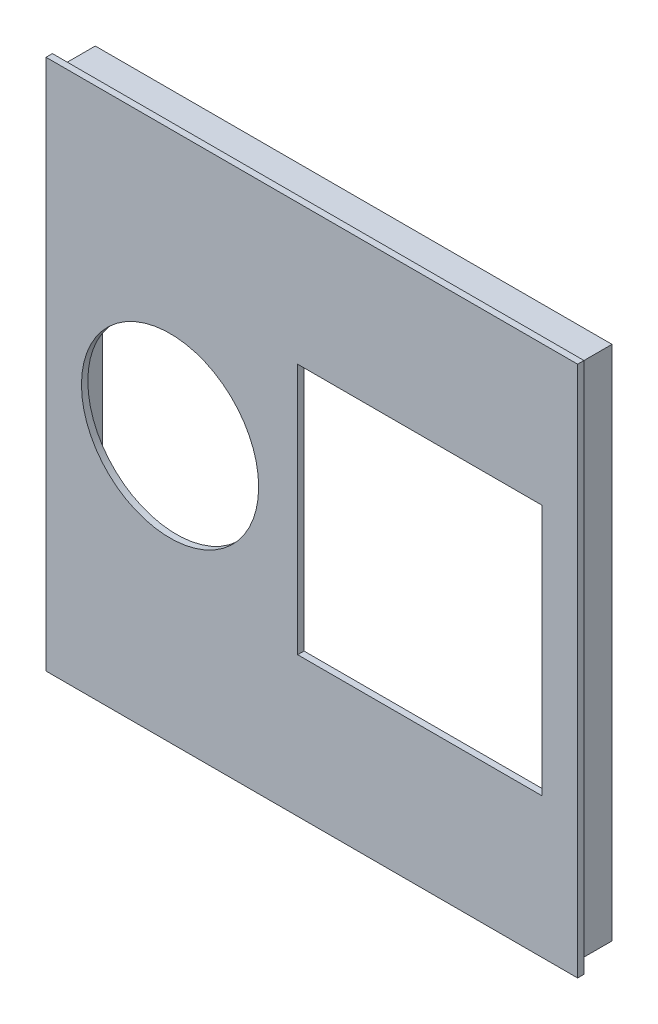
ISO-10303-21;
HEADER;
FILE_DESCRIPTION(('STEP AP214'),'2;1');
FILE_NAME('part.step','',(''),(''),'','','');
FILE_SCHEMA(('AUTOMOTIVE_DESIGN { 1 0 10303 214 1 1 1 1 }'));
ENDSEC;
DATA;
#1=APPLICATION_CONTEXT('core data for automotive mechanical design processes');
#2=APPLICATION_PROTOCOL_DEFINITION('international standard','automotive_design',2000,#1);
#3=PRODUCT_CONTEXT('',#1,'mechanical');
#4=PRODUCT('Part','Part','',(#3));
#5=PRODUCT_RELATED_PRODUCT_CATEGORY('part','',(#4));
#6=PRODUCT_DEFINITION_FORMATION('','',#4);
#7=PRODUCT_DEFINITION_CONTEXT('part definition',#1,'design');
#8=PRODUCT_DEFINITION('design','',#6,#7);
#9=PRODUCT_DEFINITION_SHAPE('','',#8);
#10=(LENGTH_UNIT() NAMED_UNIT(*) SI_UNIT(.MILLI.,.METRE.));
#11=(NAMED_UNIT(*) PLANE_ANGLE_UNIT() SI_UNIT($,.RADIAN.));
#12=(NAMED_UNIT(*) SI_UNIT($,.STERADIAN.) SOLID_ANGLE_UNIT());
#13=UNCERTAINTY_MEASURE_WITH_UNIT(LENGTH_MEASURE(1.E-05),#10,'distance_accuracy_value','');
#14=(GEOMETRIC_REPRESENTATION_CONTEXT(3) GLOBAL_UNCERTAINTY_ASSIGNED_CONTEXT((#13)) GLOBAL_UNIT_ASSIGNED_CONTEXT((#10,
#11,#12)) REPRESENTATION_CONTEXT('',''));
#15=CARTESIAN_POINT('',(0.,0.,0.));
#16=DIRECTION('',(0.,0.,1.));
#17=DIRECTION('',(1.,0.,0.));
#18=AXIS2_PLACEMENT_3D('',#15,#16,#17);
#19=CARTESIAN_POINT('',(0.,0.,0.));
#20=DIRECTION('',(0.,0.,1.));
#21=DIRECTION('',(1.,0.,0.));
#22=AXIS2_PLACEMENT_3D('',#19,#20,#21);
#23=PLANE('',#22);
#24=DIRECTION('',(0.,-1.,0.));
#25=VECTOR('',#24,1.);
#26=CARTESIAN_POINT('',(-17.4246522904172,7.44705882352941,0.));
#27=LINE('',#26,#25);
#28=CARTESIAN_POINT('',(-17.4246522904172,7.44705882352941,0.));
#29=VERTEX_POINT('',#28);
#30=CARTESIAN_POINT('',(-17.4246522904172,-142.552941176471,0.));
#31=VERTEX_POINT('',#30);
#32=EDGE_CURVE('E251',#29,#31,#27,.T.);
#33=ORIENTED_EDGE('',*,*,#32,.F.);
#34=DIRECTION('',(-1.,0.,0.));
#35=VECTOR('',#34,1.);
#36=CARTESIAN_POINT('',(-17.4246522904172,7.44705882352941,0.));
#37=LINE('',#36,#35);
#38=CARTESIAN_POINT('',(132.575347709583,7.44705882352941,0.));
#39=VERTEX_POINT('',#38);
#40=EDGE_CURVE('E256',#39,#29,#37,.T.);
#41=ORIENTED_EDGE('',*,*,#40,.F.);
#42=DIRECTION('',(0.,1.,0.));
#43=VECTOR('',#42,1.);
#44=CARTESIAN_POINT('',(132.575347709583,7.44705882352941,0.));
#45=LINE('',#44,#43);
#46=CARTESIAN_POINT('',(132.575347709583,-142.552941176471,0.));
#47=VERTEX_POINT('',#46);
#48=EDGE_CURVE('E267',#47,#39,#45,.T.);
#49=ORIENTED_EDGE('',*,*,#48,.F.);
#50=DIRECTION('',(1.,0.,0.));
#51=VECTOR('',#50,1.);
#52=CARTESIAN_POINT('',(-17.4246522904172,-142.552941176471,0.));
#53=LINE('',#52,#51);
#54=EDGE_CURVE('E265',#31,#47,#53,.T.);
#55=ORIENTED_EDGE('',*,*,#54,.F.);
#56=EDGE_LOOP('',(#33,#41,#49,#55));
#57=FACE_BOUND('',#56,.T.);
#58=DIRECTION('',(0.,1.,0.));
#59=VECTOR('',#58,1.);
#60=CARTESIAN_POINT('',(-15.3246522904172,-140.452941176471,0.));
#61=LINE('',#60,#59);
#62=CARTESIAN_POINT('',(-15.3246522904172,-140.452941176471,0.));
#63=VERTEX_POINT('',#62);
#64=CARTESIAN_POINT('',(-15.3246522904172,5.34705882352941,0.));
#65=VERTEX_POINT('',#64);
#66=EDGE_CURVE('E163',#63,#65,#61,.T.);
#67=ORIENTED_EDGE('',*,*,#66,.F.);
#68=DIRECTION('',(-1.,0.,0.));
#69=VECTOR('',#68,1.);
#70=CARTESIAN_POINT('',(-15.3246522904172,-140.452941176471,0.));
#71=LINE('',#70,#69);
#72=CARTESIAN_POINT('',(130.475347709583,-140.452941176471,0.));
#73=VERTEX_POINT('',#72);
#74=EDGE_CURVE('E191',#73,#63,#71,.T.);
#75=ORIENTED_EDGE('',*,*,#74,.F.);
#76=DIRECTION('',(0.,-1.,0.));
#77=VECTOR('',#76,1.);
#78=CARTESIAN_POINT('',(130.475347709583,-140.452941176471,0.));
#79=LINE('',#78,#77);
#80=CARTESIAN_POINT('',(130.475347709583,5.34705882352939,0.));
#81=VERTEX_POINT('',#80);
#82=EDGE_CURVE('E53',#81,#73,#79,.T.);
#83=ORIENTED_EDGE('',*,*,#82,.F.);
#84=DIRECTION('',(1.,0.,0.));
#85=VECTOR('',#84,1.);
#86=CARTESIAN_POINT('',(-15.3246522904172,5.34705882352941,0.));
#87=LINE('',#86,#85);
#88=EDGE_CURVE('E48',#65,#81,#87,.T.);
#89=ORIENTED_EDGE('',*,*,#88,.F.);
#90=EDGE_LOOP('',(#67,#75,#83,#89));
#91=FACE_BOUND('',#90,.T.);
#92=ADVANCED_FACE('F33',(#57,#91),#23,.F.);
#93=CARTESIAN_POINT('',(0.,0.,1.8));
#94=DIRECTION('',(0.,0.,1.));
#95=DIRECTION('',(1.,0.,0.));
#96=AXIS2_PLACEMENT_3D('',#93,#94,#95);
#97=PLANE('',#96);
#98=DIRECTION('',(1.,0.,0.));
#99=VECTOR('',#98,1.);
#100=CARTESIAN_POINT('',(53.5753477095828,-103.052941176471,1.8));
#101=LINE('',#100,#99);
#102=CARTESIAN_POINT('',(53.5753477095828,-103.052941176471,1.8));
#103=VERTEX_POINT('',#102);
#104=CARTESIAN_POINT('',(122.575347709583,-103.052941176471,1.8));
#105=VERTEX_POINT('',#104);
#106=EDGE_CURVE('E223',#103,#105,#101,.T.);
#107=ORIENTED_EDGE('',*,*,#106,.F.);
#108=DIRECTION('',(0.,-1.,0.));
#109=VECTOR('',#108,1.);
#110=CARTESIAN_POINT('',(53.5753477095828,-32.0529411764706,1.8));
#111=LINE('',#110,#109);
#112=CARTESIAN_POINT('',(53.5753477095828,-32.0529411764706,1.8));
#113=VERTEX_POINT('',#112);
#114=EDGE_CURVE('E221',#113,#103,#111,.T.);
#115=ORIENTED_EDGE('',*,*,#114,.F.);
#116=DIRECTION('',(-1.,0.,0.));
#117=VECTOR('',#116,1.);
#118=CARTESIAN_POINT('',(53.5753477095828,-32.0529411764706,1.8));
#119=LINE('',#118,#117);
#120=CARTESIAN_POINT('',(122.575347709583,-32.0529411764706,1.8));
#121=VERTEX_POINT('',#120);
#122=EDGE_CURVE('E229',#121,#113,#119,.T.);
#123=ORIENTED_EDGE('',*,*,#122,.F.);
#124=DIRECTION('',(0.,1.,0.));
#125=VECTOR('',#124,1.);
#126=CARTESIAN_POINT('',(122.575347709583,-32.0529411764706,1.8));
#127=LINE('',#126,#125);
#128=EDGE_CURVE('E226',#105,#121,#127,.T.);
#129=ORIENTED_EDGE('',*,*,#128,.F.);
#130=EDGE_LOOP('',(#107,#115,#123,#129));
#131=FACE_BOUND('',#130,.T.);
#132=DIRECTION('',(0.,-1.,0.));
#133=VECTOR('',#132,1.);
#134=CARTESIAN_POINT('',(-17.4246522904172,7.44705882352941,1.8));
#135=LINE('',#134,#133);
#136=CARTESIAN_POINT('',(-17.4246522904172,7.44705882352941,1.8));
#137=VERTEX_POINT('',#136);
#138=CARTESIAN_POINT('',(-17.4246522904172,-142.552941176471,1.8));
#139=VERTEX_POINT('',#138);
#140=EDGE_CURVE('E252',#137,#139,#135,.T.);
#141=ORIENTED_EDGE('',*,*,#140,.T.);
#142=DIRECTION('',(1.,0.,0.));
#143=VECTOR('',#142,1.);
#144=CARTESIAN_POINT('',(-17.4246522904172,-142.552941176471,1.8));
#145=LINE('',#144,#143);
#146=CARTESIAN_POINT('',(132.575347709583,-142.552941176471,1.8));
#147=VERTEX_POINT('',#146);
#148=EDGE_CURVE('E255',#139,#147,#145,.T.);
#149=ORIENTED_EDGE('',*,*,#148,.T.);
#150=DIRECTION('',(0.,1.,0.));
#151=VECTOR('',#150,1.);
#152=CARTESIAN_POINT('',(132.575347709583,7.44705882352941,1.8));
#153=LINE('',#152,#151);
#154=CARTESIAN_POINT('',(132.575347709583,7.44705882352941,1.8));
#155=VERTEX_POINT('',#154);
#156=EDGE_CURVE('E258',#147,#155,#153,.T.);
#157=ORIENTED_EDGE('',*,*,#156,.T.);
#158=DIRECTION('',(-1.,0.,0.));
#159=VECTOR('',#158,1.);
#160=CARTESIAN_POINT('',(-17.4246522904172,7.44705882352941,1.8));
#161=LINE('',#160,#159);
#162=EDGE_CURVE('E260',#155,#137,#161,.T.);
#163=ORIENTED_EDGE('',*,*,#162,.T.);
#164=EDGE_LOOP('',(#141,#149,#157,#163));
#165=FACE_BOUND('',#164,.T.);
#166=CARTESIAN_POINT('',(17.5753477095828,-67.5529411764706,1.8));
#167=DIRECTION('',(0.,0.,1.));
#168=DIRECTION('',(1.,0.,0.));
#169=AXIS2_PLACEMENT_3D('',#166,#167,#168);
#170=CIRCLE('',#169,25.);
#171=CARTESIAN_POINT('',(42.5753477095828,-67.5529411764706,1.8));
#172=VERTEX_POINT('',#171);
#173=EDGE_CURVE('E215',#172,#172,#170,.T.);
#174=ORIENTED_EDGE('',*,*,#173,.F.);
#175=EDGE_LOOP('',(#174));
#176=FACE_BOUND('',#175,.T.);
#177=ADVANCED_FACE('F293',(#131,#165,#176),#97,.T.);
#178=DIRECTION('',(-1.,0.,0.));
#179=VECTOR('',#178,1.);
#180=CARTESIAN_POINT('',(-13.2246522904172,-138.352941176471,0.));
#181=LINE('',#180,#179);
#182=CARTESIAN_POINT('',(128.375347709583,-138.352941176471,0.));
#183=VERTEX_POINT('',#182);
#184=CARTESIAN_POINT('',(-13.2246522904172,-138.352941176471,0.));
#185=VERTEX_POINT('',#184);
#186=EDGE_CURVE('E156',#183,#185,#181,.T.);
#187=ORIENTED_EDGE('',*,*,#186,.T.);
#188=DIRECTION('',(0.,1.,0.));
#189=VECTOR('',#188,1.);
#190=CARTESIAN_POINT('',(-13.2246522904172,-138.352941176471,0.));
#191=LINE('',#190,#189);
#192=CARTESIAN_POINT('',(-13.2246522904172,3.24705882352941,0.));
#193=VERTEX_POINT('',#192);
#194=EDGE_CURVE('E175',#185,#193,#191,.T.);
#195=ORIENTED_EDGE('',*,*,#194,.T.);
#196=DIRECTION('',(1.,0.,0.));
#197=VECTOR('',#196,1.);
#198=CARTESIAN_POINT('',(-13.2246522904172,3.24705882352941,0.));
#199=LINE('',#198,#197);
#200=CARTESIAN_POINT('',(128.375347709583,3.24705882352939,0.));
#201=VERTEX_POINT('',#200);
#202=EDGE_CURVE('E162',#193,#201,#199,.T.);
#203=ORIENTED_EDGE('',*,*,#202,.T.);
#204=DIRECTION('',(0.,-1.,0.));
#205=VECTOR('',#204,1.);
#206=CARTESIAN_POINT('',(128.375347709583,-138.352941176471,0.));
#207=LINE('',#206,#205);
#208=EDGE_CURVE('E178',#201,#183,#207,.T.);
#209=ORIENTED_EDGE('',*,*,#208,.T.);
#210=EDGE_LOOP('',(#187,#195,#203,#209));
#211=FACE_BOUND('',#210,.T.);
#212=DIRECTION('',(0.,-1.,0.));
#213=VECTOR('',#212,1.);
#214=CARTESIAN_POINT('',(53.5753477095828,-32.0529411764706,0.));
#215=LINE('',#214,#213);
#216=CARTESIAN_POINT('',(53.5753477095828,-32.0529411764706,0.));
#217=VERTEX_POINT('',#216);
#218=CARTESIAN_POINT('',(53.5753477095828,-103.052941176471,0.));
#219=VERTEX_POINT('',#218);
#220=EDGE_CURVE('E218',#217,#219,#215,.T.);
#221=ORIENTED_EDGE('',*,*,#220,.T.);
#222=DIRECTION('',(1.,0.,0.));
#223=VECTOR('',#222,1.);
#224=CARTESIAN_POINT('',(53.5753477095828,-103.052941176471,0.));
#225=LINE('',#224,#223);
#226=CARTESIAN_POINT('',(122.575347709583,-103.052941176471,0.));
#227=VERTEX_POINT('',#226);
#228=EDGE_CURVE('E234',#219,#227,#225,.T.);
#229=ORIENTED_EDGE('',*,*,#228,.T.);
#230=DIRECTION('',(0.,1.,0.));
#231=VECTOR('',#230,1.);
#232=CARTESIAN_POINT('',(122.575347709583,-32.0529411764706,0.));
#233=LINE('',#232,#231);
#234=CARTESIAN_POINT('',(122.575347709583,-32.0529411764706,0.));
#235=VERTEX_POINT('',#234);
#236=EDGE_CURVE('E237',#227,#235,#233,.T.);
#237=ORIENTED_EDGE('',*,*,#236,.T.);
#238=DIRECTION('',(-1.,0.,0.));
#239=VECTOR('',#238,1.);
#240=CARTESIAN_POINT('',(53.5753477095828,-32.0529411764706,0.));
#241=LINE('',#240,#239);
#242=EDGE_CURVE('E224',#235,#217,#241,.T.);
#243=ORIENTED_EDGE('',*,*,#242,.T.);
#244=EDGE_LOOP('',(#221,#229,#237,#243));
#245=FACE_BOUND('',#244,.T.);
#246=CARTESIAN_POINT('',(17.5753477095828,-67.5529411764706,0.));
#247=DIRECTION('',(0.,0.,1.));
#248=DIRECTION('',(1.,0.,0.));
#249=AXIS2_PLACEMENT_3D('',#246,#247,#248);
#250=CIRCLE('',#249,25.);
#251=CARTESIAN_POINT('',(42.5753477095828,-67.5529411764706,0.));
#252=VERTEX_POINT('',#251);
#253=EDGE_CURVE('E214',#252,#252,#250,.T.);
#254=ORIENTED_EDGE('',*,*,#253,.T.);
#255=EDGE_LOOP('',(#254));
#256=FACE_BOUND('',#255,.T.);
#257=ADVANCED_FACE('F302',(#211,#245,#256),#23,.F.);
#258=CARTESIAN_POINT('',(-17.4246522904172,7.44705882352941,1.8));
#259=DIRECTION('',(1.,0.,0.));
#260=DIRECTION('',(0.,1.,0.));
#261=AXIS2_PLACEMENT_3D('',#258,#259,#260);
#262=PLANE('',#261);
#263=ORIENTED_EDGE('',*,*,#32,.T.);
#264=DIRECTION('',(0.,0.,-1.));
#265=VECTOR('',#264,1.);
#266=CARTESIAN_POINT('',(-17.4246522904172,-142.552941176471,1.8));
#267=LINE('',#266,#265);
#268=EDGE_CURVE('E11',#139,#31,#267,.T.);
#269=ORIENTED_EDGE('',*,*,#268,.F.);
#270=ORIENTED_EDGE('',*,*,#140,.F.);
#271=DIRECTION('',(0.,0.,-1.));
#272=VECTOR('',#271,1.);
#273=CARTESIAN_POINT('',(-17.4246522904172,7.44705882352941,1.8));
#274=LINE('',#273,#272);
#275=EDGE_CURVE('E262',#137,#29,#274,.T.);
#276=ORIENTED_EDGE('',*,*,#275,.T.);
#277=EDGE_LOOP('',(#263,#269,#270,#276));
#278=FACE_BOUND('',#277,.T.);
#279=ADVANCED_FACE('F35',(#278),#262,.F.);
#280=CARTESIAN_POINT('',(-17.4246522904172,-142.552941176471,1.8));
#281=DIRECTION('',(0.,1.,0.));
#282=DIRECTION('',(0.,0.,1.));
#283=AXIS2_PLACEMENT_3D('',#280,#281,#282);
#284=PLANE('',#283);
#285=ORIENTED_EDGE('',*,*,#54,.T.);
#286=DIRECTION('',(0.,0.,-1.));
#287=VECTOR('',#286,1.);
#288=CARTESIAN_POINT('',(132.575347709583,-142.552941176471,1.8));
#289=LINE('',#288,#287);
#290=EDGE_CURVE('E41',#147,#47,#289,.T.);
#291=ORIENTED_EDGE('',*,*,#290,.F.);
#292=ORIENTED_EDGE('',*,*,#148,.F.);
#293=ORIENTED_EDGE('',*,*,#268,.T.);
#294=EDGE_LOOP('',(#285,#291,#292,#293));
#295=FACE_BOUND('',#294,.T.);
#296=ADVANCED_FACE('F295',(#295),#284,.F.);
#297=CARTESIAN_POINT('',(132.575347709583,7.44705882352941,1.8));
#298=DIRECTION('',(-1.,0.,0.));
#299=DIRECTION('',(0.,-1.,0.));
#300=AXIS2_PLACEMENT_3D('',#297,#298,#299);
#301=PLANE('',#300);
#302=ORIENTED_EDGE('',*,*,#48,.T.);
#303=DIRECTION('',(0.,0.,-1.));
#304=VECTOR('',#303,1.);
#305=CARTESIAN_POINT('',(132.575347709583,7.44705882352941,1.8));
#306=LINE('',#305,#304);
#307=EDGE_CURVE('E272',#155,#39,#306,.T.);
#308=ORIENTED_EDGE('',*,*,#307,.F.);
#309=ORIENTED_EDGE('',*,*,#156,.F.);
#310=ORIENTED_EDGE('',*,*,#290,.T.);
#311=EDGE_LOOP('',(#302,#308,#309,#310));
#312=FACE_BOUND('',#311,.T.);
#313=ADVANCED_FACE('F279',(#312),#301,.F.);
#314=CARTESIAN_POINT('',(-17.4246522904172,7.44705882352941,1.8));
#315=DIRECTION('',(0.,-1.,0.));
#316=DIRECTION('',(0.,0.,-1.));
#317=AXIS2_PLACEMENT_3D('',#314,#315,#316);
#318=PLANE('',#317);
#319=ORIENTED_EDGE('',*,*,#40,.T.);
#320=ORIENTED_EDGE('',*,*,#275,.F.);
#321=ORIENTED_EDGE('',*,*,#162,.F.);
#322=ORIENTED_EDGE('',*,*,#307,.T.);
#323=EDGE_LOOP('',(#319,#320,#321,#322));
#324=FACE_BOUND('',#323,.T.);
#325=ADVANCED_FACE('F287',(#324),#318,.F.);
#326=CARTESIAN_POINT('',(53.5753477095828,-32.0529411764706,1.8));
#327=DIRECTION('',(1.,0.,0.));
#328=DIRECTION('',(0.,1.,0.));
#329=AXIS2_PLACEMENT_3D('',#326,#327,#328);
#330=PLANE('',#329);
#331=ORIENTED_EDGE('',*,*,#220,.F.);
#332=DIRECTION('',(0.,0.,-1.));
#333=VECTOR('',#332,1.);
#334=CARTESIAN_POINT('',(53.5753477095828,-32.0529411764706,1.8));
#335=LINE('',#334,#333);
#336=EDGE_CURVE('E231',#113,#217,#335,.T.);
#337=ORIENTED_EDGE('',*,*,#336,.F.);
#338=ORIENTED_EDGE('',*,*,#114,.T.);
#339=DIRECTION('',(0.,0.,-1.));
#340=VECTOR('',#339,1.);
#341=CARTESIAN_POINT('',(53.5753477095828,-103.052941176471,1.8));
#342=LINE('',#341,#340);
#343=EDGE_CURVE('E248',#103,#219,#342,.T.);
#344=ORIENTED_EDGE('',*,*,#343,.T.);
#345=EDGE_LOOP('',(#331,#337,#338,#344));
#346=FACE_BOUND('',#345,.T.);
#347=ADVANCED_FACE('F344',(#346),#330,.T.);
#348=CARTESIAN_POINT('',(53.5753477095828,-103.052941176471,1.8));
#349=DIRECTION('',(0.,1.,0.));
#350=DIRECTION('',(0.,0.,1.));
#351=AXIS2_PLACEMENT_3D('',#348,#349,#350);
#352=PLANE('',#351);
#353=ORIENTED_EDGE('',*,*,#228,.F.);
#354=ORIENTED_EDGE('',*,*,#343,.F.);
#355=ORIENTED_EDGE('',*,*,#106,.T.);
#356=DIRECTION('',(0.,0.,-1.));
#357=VECTOR('',#356,1.);
#358=CARTESIAN_POINT('',(122.575347709583,-103.052941176471,1.8));
#359=LINE('',#358,#357);
#360=EDGE_CURVE('E246',#105,#227,#359,.T.);
#361=ORIENTED_EDGE('',*,*,#360,.T.);
#362=EDGE_LOOP('',(#353,#354,#355,#361));
#363=FACE_BOUND('',#362,.T.);
#364=ADVANCED_FACE('F340',(#363),#352,.T.);
#365=CARTESIAN_POINT('',(122.575347709583,-32.0529411764706,1.8));
#366=DIRECTION('',(-1.,0.,0.));
#367=DIRECTION('',(0.,-1.,0.));
#368=AXIS2_PLACEMENT_3D('',#365,#366,#367);
#369=PLANE('',#368);
#370=ORIENTED_EDGE('',*,*,#236,.F.);
#371=ORIENTED_EDGE('',*,*,#360,.F.);
#372=ORIENTED_EDGE('',*,*,#128,.T.);
#373=DIRECTION('',(0.,0.,-1.));
#374=VECTOR('',#373,1.);
#375=CARTESIAN_POINT('',(122.575347709583,-32.0529411764706,1.8));
#376=LINE('',#375,#374);
#377=EDGE_CURVE('E244',#121,#235,#376,.T.);
#378=ORIENTED_EDGE('',*,*,#377,.T.);
#379=EDGE_LOOP('',(#370,#371,#372,#378));
#380=FACE_BOUND('',#379,.T.);
#381=ADVANCED_FACE('F332',(#380),#369,.T.);
#382=CARTESIAN_POINT('',(53.5753477095828,-32.0529411764706,1.8));
#383=DIRECTION('',(0.,-1.,0.));
#384=DIRECTION('',(0.,0.,-1.));
#385=AXIS2_PLACEMENT_3D('',#382,#383,#384);
#386=PLANE('',#385);
#387=ORIENTED_EDGE('',*,*,#242,.F.);
#388=ORIENTED_EDGE('',*,*,#377,.F.);
#389=ORIENTED_EDGE('',*,*,#122,.T.);
#390=ORIENTED_EDGE('',*,*,#336,.T.);
#391=EDGE_LOOP('',(#387,#388,#389,#390));
#392=FACE_BOUND('',#391,.T.);
#393=ADVANCED_FACE('F322',(#392),#386,.T.);
#394=CARTESIAN_POINT('',(17.5753477095828,-67.5529411764706,1.8));
#395=DIRECTION('',(0.,0.,-1.));
#396=DIRECTION('',(-1.,0.,0.));
#397=AXIS2_PLACEMENT_3D('',#394,#395,#396);
#398=CYLINDRICAL_SURFACE('',#397,25.);
#399=ORIENTED_EDGE('',*,*,#173,.T.);
#400=EDGE_LOOP('',(#399));
#401=FACE_BOUND('',#400,.T.);
#402=ORIENTED_EDGE('',*,*,#253,.F.);
#403=EDGE_LOOP('',(#402));
#404=FACE_BOUND('',#403,.T.);
#405=ADVANCED_FACE('F320',(#401,#404),#398,.F.);
#406=CARTESIAN_POINT('',(0.,0.,-10.));
#407=DIRECTION('',(0.,0.,-1.));
#408=DIRECTION('',(-1.,0.,0.));
#409=AXIS2_PLACEMENT_3D('',#406,#407,#408);
#410=PLANE('',#409);
#411=DIRECTION('',(0.,1.,0.));
#412=VECTOR('',#411,1.);
#413=CARTESIAN_POINT('',(-15.3246522904172,-140.452941176471,-10.));
#414=LINE('',#413,#412);
#415=CARTESIAN_POINT('',(-15.3246522904172,-140.452941176471,-10.));
#416=VERTEX_POINT('',#415);
#417=CARTESIAN_POINT('',(-15.3246522904172,5.34705882352941,-10.));
#418=VERTEX_POINT('',#417);
#419=EDGE_CURVE('E187',#416,#418,#414,.T.);
#420=ORIENTED_EDGE('',*,*,#419,.T.);
#421=DIRECTION('',(1.,0.,0.));
#422=VECTOR('',#421,1.);
#423=CARTESIAN_POINT('',(-15.3246522904172,5.34705882352941,-10.));
#424=LINE('',#423,#422);
#425=CARTESIAN_POINT('',(130.475347709583,5.34705882352939,-10.));
#426=VERTEX_POINT('',#425);
#427=EDGE_CURVE('E190',#418,#426,#424,.T.);
#428=ORIENTED_EDGE('',*,*,#427,.T.);
#429=DIRECTION('',(0.,-1.,0.));
#430=VECTOR('',#429,1.);
#431=CARTESIAN_POINT('',(130.475347709583,-140.452941176471,-10.));
#432=LINE('',#431,#430);
#433=CARTESIAN_POINT('',(130.475347709583,-140.452941176471,-10.));
#434=VERTEX_POINT('',#433);
#435=EDGE_CURVE('E193',#426,#434,#432,.T.);
#436=ORIENTED_EDGE('',*,*,#435,.T.);
#437=DIRECTION('',(-1.,0.,0.));
#438=VECTOR('',#437,1.);
#439=CARTESIAN_POINT('',(-15.3246522904172,-140.452941176471,-10.));
#440=LINE('',#439,#438);
#441=EDGE_CURVE('E195',#434,#416,#440,.T.);
#442=ORIENTED_EDGE('',*,*,#441,.T.);
#443=EDGE_LOOP('',(#420,#428,#436,#442));
#444=FACE_BOUND('',#443,.T.);
#445=DIRECTION('',(1.,0.,0.));
#446=VECTOR('',#445,1.);
#447=CARTESIAN_POINT('',(-13.2246522904172,3.24705882352941,-10.));
#448=LINE('',#447,#446);
#449=CARTESIAN_POINT('',(-13.2246522904172,3.24705882352941,-10.));
#450=VERTEX_POINT('',#449);
#451=CARTESIAN_POINT('',(128.375347709583,3.24705882352939,-10.));
#452=VERTEX_POINT('',#451);
#453=EDGE_CURVE('E155',#450,#452,#448,.T.);
#454=ORIENTED_EDGE('',*,*,#453,.F.);
#455=DIRECTION('',(0.,1.,0.));
#456=VECTOR('',#455,1.);
#457=CARTESIAN_POINT('',(-13.2246522904172,-138.352941176471,-10.));
#458=LINE('',#457,#456);
#459=CARTESIAN_POINT('',(-13.2246522904172,-138.352941176471,-10.));
#460=VERTEX_POINT('',#459);
#461=EDGE_CURVE('E145',#460,#450,#458,.T.);
#462=ORIENTED_EDGE('',*,*,#461,.F.);
#463=DIRECTION('',(-1.,0.,0.));
#464=VECTOR('',#463,1.);
#465=CARTESIAN_POINT('',(-13.2246522904172,-138.352941176471,-10.));
#466=LINE('',#465,#464);
#467=CARTESIAN_POINT('',(128.375347709583,-138.352941176471,-10.));
#468=VERTEX_POINT('',#467);
#469=EDGE_CURVE('E171',#468,#460,#466,.T.);
#470=ORIENTED_EDGE('',*,*,#469,.F.);
#471=DIRECTION('',(0.,-1.,0.));
#472=VECTOR('',#471,1.);
#473=CARTESIAN_POINT('',(128.375347709583,-138.352941176471,-10.));
#474=LINE('',#473,#472);
#475=EDGE_CURVE('E169',#452,#468,#474,.T.);
#476=ORIENTED_EDGE('',*,*,#475,.F.);
#477=EDGE_LOOP('',(#454,#462,#470,#476));
#478=FACE_BOUND('',#477,.T.);
#479=ADVANCED_FACE('F167',(#444,#478),#410,.T.);
#480=CARTESIAN_POINT('',(-15.3246522904172,-140.452941176471,-10.));
#481=DIRECTION('',(1.,0.,0.));
#482=DIRECTION('',(0.,0.,-1.));
#483=AXIS2_PLACEMENT_3D('',#480,#481,#482);
#484=PLANE('',#483);
#485=ORIENTED_EDGE('',*,*,#66,.T.);
#486=DIRECTION('',(0.,0.,1.));
#487=VECTOR('',#486,1.);
#488=CARTESIAN_POINT('',(-15.3246522904172,5.34705882352941,-10.));
#489=LINE('',#488,#487);
#490=EDGE_CURVE('E212',#418,#65,#489,.T.);
#491=ORIENTED_EDGE('',*,*,#490,.F.);
#492=ORIENTED_EDGE('',*,*,#419,.F.);
#493=DIRECTION('',(0.,0.,1.));
#494=VECTOR('',#493,1.);
#495=CARTESIAN_POINT('',(-15.3246522904172,-140.452941176471,-10.));
#496=LINE('',#495,#494);
#497=EDGE_CURVE('E197',#416,#63,#496,.T.);
#498=ORIENTED_EDGE('',*,*,#497,.T.);
#499=EDGE_LOOP('',(#485,#491,#492,#498));
#500=FACE_BOUND('',#499,.T.);
#501=ADVANCED_FACE('F329',(#500),#484,.F.);
#502=CARTESIAN_POINT('',(-15.3246522904172,5.34705882352941,-10.));
#503=DIRECTION('',(0.,-1.,0.));
#504=DIRECTION('',(1.,0.,0.));
#505=AXIS2_PLACEMENT_3D('',#502,#503,#504);
#506=PLANE('',#505);
#507=ORIENTED_EDGE('',*,*,#88,.T.);
#508=DIRECTION('',(0.,0.,1.));
#509=VECTOR('',#508,1.);
#510=CARTESIAN_POINT('',(130.475347709583,5.34705882352939,-10.));
#511=LINE('',#510,#509);
#512=EDGE_CURVE('E209',#426,#81,#511,.T.);
#513=ORIENTED_EDGE('',*,*,#512,.F.);
#514=ORIENTED_EDGE('',*,*,#427,.F.);
#515=ORIENTED_EDGE('',*,*,#490,.T.);
#516=EDGE_LOOP('',(#507,#513,#514,#515));
#517=FACE_BOUND('',#516,.T.);
#518=ADVANCED_FACE('F403',(#517),#506,.F.);
#519=CARTESIAN_POINT('',(130.475347709583,-140.452941176471,-10.));
#520=DIRECTION('',(-1.,0.,0.));
#521=DIRECTION('',(0.,0.,1.));
#522=AXIS2_PLACEMENT_3D('',#519,#520,#521);
#523=PLANE('',#522);
#524=ORIENTED_EDGE('',*,*,#82,.T.);
#525=DIRECTION('',(0.,0.,1.));
#526=VECTOR('',#525,1.);
#527=CARTESIAN_POINT('',(130.475347709583,-140.452941176471,-10.));
#528=LINE('',#527,#526);
#529=EDGE_CURVE('E206',#434,#73,#528,.T.);
#530=ORIENTED_EDGE('',*,*,#529,.F.);
#531=ORIENTED_EDGE('',*,*,#435,.F.);
#532=ORIENTED_EDGE('',*,*,#512,.T.);
#533=EDGE_LOOP('',(#524,#530,#531,#532));
#534=FACE_BOUND('',#533,.T.);
#535=ADVANCED_FACE('F412',(#534),#523,.F.);
#536=CARTESIAN_POINT('',(-15.3246522904172,-140.452941176471,-10.));
#537=DIRECTION('',(0.,1.,0.));
#538=DIRECTION('',(-1.,0.,0.));
#539=AXIS2_PLACEMENT_3D('',#536,#537,#538);
#540=PLANE('',#539);
#541=ORIENTED_EDGE('',*,*,#74,.T.);
#542=ORIENTED_EDGE('',*,*,#497,.F.);
#543=ORIENTED_EDGE('',*,*,#441,.F.);
#544=ORIENTED_EDGE('',*,*,#529,.T.);
#545=EDGE_LOOP('',(#541,#542,#543,#544));
#546=FACE_BOUND('',#545,.T.);
#547=ADVANCED_FACE('F421',(#546),#540,.F.);
#548=CARTESIAN_POINT('',(-13.2246522904172,-138.352941176471,-10.));
#549=DIRECTION('',(1.,0.,0.));
#550=DIRECTION('',(0.,0.,-1.));
#551=AXIS2_PLACEMENT_3D('',#548,#549,#550);
#552=PLANE('',#551);
#553=ORIENTED_EDGE('',*,*,#194,.F.);
#554=DIRECTION('',(0.,0.,1.));
#555=VECTOR('',#554,1.);
#556=CARTESIAN_POINT('',(-13.2246522904172,-138.352941176471,-10.));
#557=LINE('',#556,#555);
#558=EDGE_CURVE('E151',#460,#185,#557,.T.);
#559=ORIENTED_EDGE('',*,*,#558,.F.);
#560=ORIENTED_EDGE('',*,*,#461,.T.);
#561=DIRECTION('',(0.,0.,1.));
#562=VECTOR('',#561,1.);
#563=CARTESIAN_POINT('',(-13.2246522904172,3.24705882352941,-10.));
#564=LINE('',#563,#562);
#565=EDGE_CURVE('E149',#450,#193,#564,.T.);
#566=ORIENTED_EDGE('',*,*,#565,.T.);
#567=EDGE_LOOP('',(#553,#559,#560,#566));
#568=FACE_BOUND('',#567,.T.);
#569=ADVANCED_FACE('F148',(#568),#552,.T.);
#570=CARTESIAN_POINT('',(-13.2246522904172,3.24705882352941,-10.));
#571=DIRECTION('',(0.,-1.,0.));
#572=DIRECTION('',(1.,0.,0.));
#573=AXIS2_PLACEMENT_3D('',#570,#571,#572);
#574=PLANE('',#573);
#575=ORIENTED_EDGE('',*,*,#202,.F.);
#576=ORIENTED_EDGE('',*,*,#565,.F.);
#577=ORIENTED_EDGE('',*,*,#453,.T.);
#578=DIRECTION('',(0.,0.,1.));
#579=VECTOR('',#578,1.);
#580=CARTESIAN_POINT('',(128.375347709583,3.24705882352939,-10.));
#581=LINE('',#580,#579);
#582=EDGE_CURVE('E164',#452,#201,#581,.T.);
#583=ORIENTED_EDGE('',*,*,#582,.T.);
#584=EDGE_LOOP('',(#575,#576,#577,#583));
#585=FACE_BOUND('',#584,.T.);
#586=ADVANCED_FACE('F159',(#585),#574,.T.);
#587=CARTESIAN_POINT('',(128.375347709583,-138.352941176471,-10.));
#588=DIRECTION('',(-1.,0.,0.));
#589=DIRECTION('',(0.,0.,1.));
#590=AXIS2_PLACEMENT_3D('',#587,#588,#589);
#591=PLANE('',#590);
#592=ORIENTED_EDGE('',*,*,#208,.F.);
#593=ORIENTED_EDGE('',*,*,#582,.F.);
#594=ORIENTED_EDGE('',*,*,#475,.T.);
#595=DIRECTION('',(0.,0.,1.));
#596=VECTOR('',#595,1.);
#597=CARTESIAN_POINT('',(128.375347709583,-138.352941176471,-10.));
#598=LINE('',#597,#596);
#599=EDGE_CURVE('E184',#468,#183,#598,.T.);
#600=ORIENTED_EDGE('',*,*,#599,.T.);
#601=EDGE_LOOP('',(#592,#593,#594,#600));
#602=FACE_BOUND('',#601,.T.);
#603=ADVANCED_FACE('F448',(#602),#591,.T.);
#604=CARTESIAN_POINT('',(-13.2246522904172,-138.352941176471,-10.));
#605=DIRECTION('',(0.,1.,0.));
#606=DIRECTION('',(-1.,0.,0.));
#607=AXIS2_PLACEMENT_3D('',#604,#605,#606);
#608=PLANE('',#607);
#609=ORIENTED_EDGE('',*,*,#186,.F.);
#610=ORIENTED_EDGE('',*,*,#599,.F.);
#611=ORIENTED_EDGE('',*,*,#469,.T.);
#612=ORIENTED_EDGE('',*,*,#558,.T.);
#613=EDGE_LOOP('',(#609,#610,#611,#612));
#614=FACE_BOUND('',#613,.T.);
#615=ADVANCED_FACE('F457',(#614),#608,.T.);
#616=CLOSED_SHELL('',(#92,#177,#257,#279,#296,#313,#325,#347,#364,#381,#393,#405,#479,#501,#518,
#535,#547,#569,#586,#603,#615));
#617=MANIFOLD_SOLID_BREP('B2',#616);
#618=ADVANCED_BREP_SHAPE_REPRESENTATION('',(#18,#617),#14);
#619=SHAPE_DEFINITION_REPRESENTATION(#9,#618);
ENDSEC;
END-ISO-10303-21;
